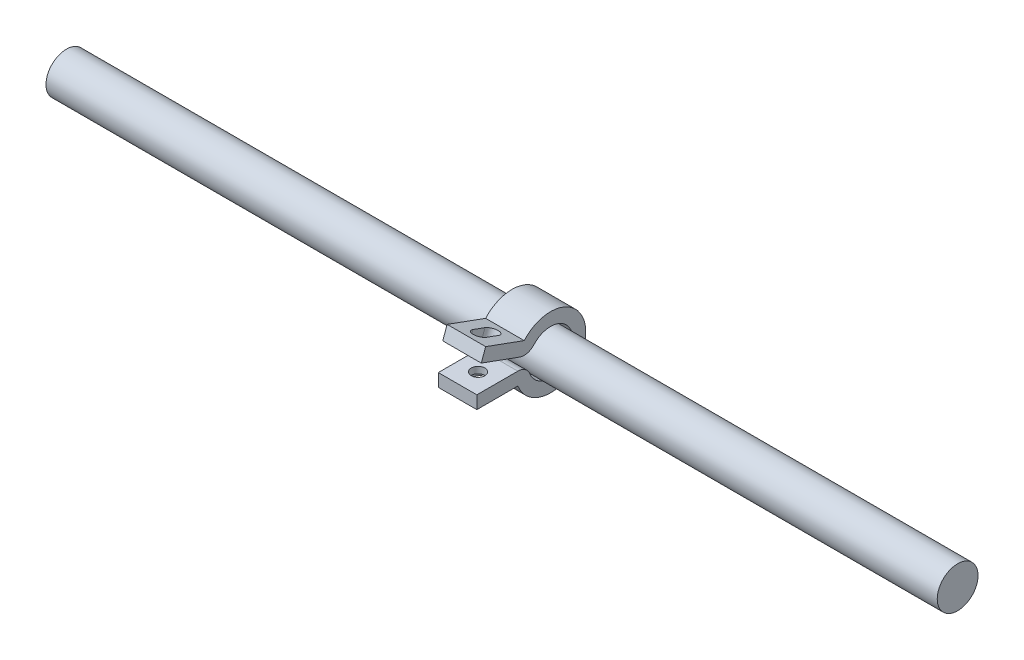
ISO-10303-21;
HEADER;
FILE_DESCRIPTION(('STEP AP214'),'2;1');
FILE_NAME('part.step','',(''),(''),'','','');
FILE_SCHEMA(('AUTOMOTIVE_DESIGN { 1 0 10303 214 1 1 1 1 }'));
ENDSEC;
DATA;
#1=APPLICATION_CONTEXT('core data for automotive mechanical design processes');
#2=APPLICATION_PROTOCOL_DEFINITION('international standard','automotive_design',2000,#1);
#3=PRODUCT_CONTEXT('',#1,'mechanical');
#4=PRODUCT('Part','Part','',(#3));
#5=PRODUCT_RELATED_PRODUCT_CATEGORY('part','',(#4));
#6=PRODUCT_DEFINITION_FORMATION('','',#4);
#7=PRODUCT_DEFINITION_CONTEXT('part definition',#1,'design');
#8=PRODUCT_DEFINITION('design','',#6,#7);
#9=PRODUCT_DEFINITION_SHAPE('','',#8);
#10=(LENGTH_UNIT() NAMED_UNIT(*) SI_UNIT(.MILLI.,.METRE.));
#11=(NAMED_UNIT(*) PLANE_ANGLE_UNIT() SI_UNIT($,.RADIAN.));
#12=(NAMED_UNIT(*) SI_UNIT($,.STERADIAN.) SOLID_ANGLE_UNIT());
#13=UNCERTAINTY_MEASURE_WITH_UNIT(LENGTH_MEASURE(1.E-05),#10,'distance_accuracy_value','');
#14=(GEOMETRIC_REPRESENTATION_CONTEXT(3) GLOBAL_UNCERTAINTY_ASSIGNED_CONTEXT((#13)) GLOBAL_UNIT_ASSIGNED_CONTEXT((#10,
#11,#12)) REPRESENTATION_CONTEXT('',''));
#15=CARTESIAN_POINT('',(0.,0.,0.));
#16=DIRECTION('',(0.,0.,1.));
#17=DIRECTION('',(1.,0.,0.));
#18=AXIS2_PLACEMENT_3D('',#15,#16,#17);
#19=CARTESIAN_POINT('',(6.,431.166,11.475));
#20=DIRECTION('',(0.,0.,-1.));
#21=DIRECTION('',(-1.,0.,0.));
#22=AXIS2_PLACEMENT_3D('',#19,#20,#21);
#23=PLANE('',#22);
#24=DIRECTION('',(0.,-1.,0.));
#25=VECTOR('',#24,1.);
#26=CARTESIAN_POINT('',(0.,431.166,11.475));
#27=LINE('',#26,#25);
#28=CARTESIAN_POINT('',(0.,431.166,11.475));
#29=VERTEX_POINT('',#28);
#30=CARTESIAN_POINT('',(0.,429.166,11.475));
#31=VERTEX_POINT('',#30);
#32=EDGE_CURVE('E265',#29,#31,#27,.T.);
#33=ORIENTED_EDGE('',*,*,#32,.T.);
#34=DIRECTION('',(-1.,0.,0.));
#35=VECTOR('',#34,1.);
#36=CARTESIAN_POINT('',(6.,429.166,11.475));
#37=LINE('',#36,#35);
#38=CARTESIAN_POINT('',(6.,429.166,11.475));
#39=VERTEX_POINT('',#38);
#40=EDGE_CURVE('E12',#39,#31,#37,.T.);
#41=ORIENTED_EDGE('',*,*,#40,.F.);
#42=DIRECTION('',(0.,-1.,0.));
#43=VECTOR('',#42,1.);
#44=CARTESIAN_POINT('',(6.,431.166,11.475));
#45=LINE('',#44,#43);
#46=CARTESIAN_POINT('',(6.,431.166,11.475));
#47=VERTEX_POINT('',#46);
#48=EDGE_CURVE('E271',#47,#39,#45,.T.);
#49=ORIENTED_EDGE('',*,*,#48,.F.);
#50=DIRECTION('',(-1.,0.,0.));
#51=VECTOR('',#50,1.);
#52=CARTESIAN_POINT('',(6.,431.166,11.475));
#53=LINE('',#52,#51);
#54=EDGE_CURVE('E293',#47,#29,#53,.T.);
#55=ORIENTED_EDGE('',*,*,#54,.T.);
#56=EDGE_LOOP('',(#33,#41,#49,#55));
#57=FACE_BOUND('',#56,.T.);
#58=ADVANCED_FACE('F47',(#57),#23,.F.);
#59=CARTESIAN_POINT('',(6.,429.166,11.475));
#60=DIRECTION('',(0.,1.,0.));
#61=DIRECTION('',(0.,0.,1.));
#62=AXIS2_PLACEMENT_3D('',#59,#60,#61);
#63=PLANE('',#62);
#64=DIRECTION('',(-1.,0.,0.));
#65=VECTOR('',#64,1.);
#66=CARTESIAN_POINT('',(4.15470053837925,429.166,10.285814393869));
#67=LINE('',#66,#65);
#68=CARTESIAN_POINT('',(4.15470053837925,429.166,10.285814393869));
#69=VERTEX_POINT('',#68);
#70=CARTESIAN_POINT('',(1.84529946162075,429.166,10.285814393869));
#71=VERTEX_POINT('',#70);
#72=EDGE_CURVE('E221',#69,#71,#67,.T.);
#73=ORIENTED_EDGE('',*,*,#72,.F.);
#74=DIRECTION('',(-0.500000000000001,0.,0.866025403784438));
#75=VECTOR('',#74,1.);
#76=CARTESIAN_POINT('',(5.3094010767585,429.166,8.28581439386901));
#77=LINE('',#76,#75);
#78=CARTESIAN_POINT('',(5.3094010767585,429.166,8.28581439386901));
#79=VERTEX_POINT('',#78);
#80=EDGE_CURVE('E61',#79,#69,#77,.T.);
#81=ORIENTED_EDGE('',*,*,#80,.F.);
#82=DIRECTION('',(0.499999999999999,0.,0.866025403784439));
#83=VECTOR('',#82,1.);
#84=CARTESIAN_POINT('',(4.15470053837925,429.166,6.28581439386901));
#85=LINE('',#84,#83);
#86=CARTESIAN_POINT('',(4.15470053837925,429.166,6.28581439386901));
#87=VERTEX_POINT('',#86);
#88=EDGE_CURVE('E204',#87,#79,#85,.T.);
#89=ORIENTED_EDGE('',*,*,#88,.F.);
#90=DIRECTION('',(1.,0.,0.));
#91=VECTOR('',#90,1.);
#92=CARTESIAN_POINT('',(1.84529946162075,429.166,6.28581439386901));
#93=LINE('',#92,#91);
#94=CARTESIAN_POINT('',(1.84529946162075,429.166,6.28581439386901));
#95=VERTEX_POINT('',#94);
#96=EDGE_CURVE('E207',#95,#87,#93,.T.);
#97=ORIENTED_EDGE('',*,*,#96,.F.);
#98=DIRECTION('',(0.5,0.,-0.866025403784439));
#99=VECTOR('',#98,1.);
#100=CARTESIAN_POINT('',(0.690598923241495,429.166,8.28581439386901));
#101=LINE('',#100,#99);
#102=CARTESIAN_POINT('',(0.690598923241495,429.166,8.28581439386901));
#103=VERTEX_POINT('',#102);
#104=EDGE_CURVE('E226',#103,#95,#101,.T.);
#105=ORIENTED_EDGE('',*,*,#104,.F.);
#106=DIRECTION('',(-0.5,0.,-0.866025403784439));
#107=VECTOR('',#106,1.);
#108=CARTESIAN_POINT('',(1.84529946162075,429.166,10.285814393869));
#109=LINE('',#108,#107);
#110=EDGE_CURVE('E223',#71,#103,#109,.T.);
#111=ORIENTED_EDGE('',*,*,#110,.F.);
#112=EDGE_LOOP('',(#73,#81,#89,#97,#105,#111));
#113=FACE_BOUND('',#112,.T.);
#114=DIRECTION('',(0.,0.,-1.));
#115=VECTOR('',#114,1.);
#116=CARTESIAN_POINT('',(0.,429.166,11.475));
#117=LINE('',#116,#115);
#118=CARTESIAN_POINT('',(0.,429.166,5.09662878773802));
#119=VERTEX_POINT('',#118);
#120=EDGE_CURVE('E296',#31,#119,#117,.T.);
#121=ORIENTED_EDGE('',*,*,#120,.T.);
#122=DIRECTION('',(-1.,0.,0.));
#123=VECTOR('',#122,1.);
#124=CARTESIAN_POINT('',(6.,429.166,5.09662878773802));
#125=LINE('',#124,#123);
#126=CARTESIAN_POINT('',(6.,429.166,5.09662878773802));
#127=VERTEX_POINT('',#126);
#128=EDGE_CURVE('E54',#127,#119,#125,.T.);
#129=ORIENTED_EDGE('',*,*,#128,.F.);
#130=DIRECTION('',(0.,0.,-1.));
#131=VECTOR('',#130,1.);
#132=CARTESIAN_POINT('',(6.,429.166,11.475));
#133=LINE('',#132,#131);
#134=EDGE_CURVE('E274',#39,#127,#133,.T.);
#135=ORIENTED_EDGE('',*,*,#134,.F.);
#136=ORIENTED_EDGE('',*,*,#40,.T.);
#137=EDGE_LOOP('',(#121,#129,#135,#136));
#138=FACE_BOUND('',#137,.T.);
#139=ADVANCED_FACE('F363',(#113,#138),#63,.F.);
#140=CARTESIAN_POINT('',(6.,431.166,0.));
#141=DIRECTION('',(-1.,0.,0.));
#142=DIRECTION('',(0.,0.,1.));
#143=AXIS2_PLACEMENT_3D('',#140,#141,#142);
#144=CYLINDRICAL_SURFACE('',#143,5.475);
#145=CARTESIAN_POINT('',(0.,431.166,0.));
#146=DIRECTION('',(1.,0.,0.));
#147=DIRECTION('',(0.,0.,-1.));
#148=AXIS2_PLACEMENT_3D('',#145,#146,#147);
#149=CIRCLE('',#148,5.475);
#150=CARTESIAN_POINT('',(0.,434.788534950032,4.10522417607114));
#151=VERTEX_POINT('',#150);
#152=EDGE_CURVE('E298',#119,#151,#149,.T.);
#153=ORIENTED_EDGE('',*,*,#152,.T.);
#154=DIRECTION('',(-1.,0.,0.));
#155=VECTOR('',#154,1.);
#156=CARTESIAN_POINT('',(6.,434.788534950032,4.10522417607114));
#157=LINE('',#156,#155);
#158=CARTESIAN_POINT('',(6.,434.788534950032,4.10522417607114));
#159=VERTEX_POINT('',#158);
#160=EDGE_CURVE('E333',#159,#151,#157,.T.);
#161=ORIENTED_EDGE('',*,*,#160,.F.);
#162=CARTESIAN_POINT('',(6.,431.166,0.));
#163=DIRECTION('',(1.,0.,0.));
#164=DIRECTION('',(0.,0.,-1.));
#165=AXIS2_PLACEMENT_3D('',#162,#163,#164);
#166=CIRCLE('',#165,5.475);
#167=EDGE_CURVE('E277',#127,#159,#166,.T.);
#168=ORIENTED_EDGE('',*,*,#167,.F.);
#169=ORIENTED_EDGE('',*,*,#128,.T.);
#170=EDGE_LOOP('',(#153,#161,#168,#169));
#171=FACE_BOUND('',#170,.T.);
#172=ADVANCED_FACE('F340',(#171),#144,.T.);
#173=CARTESIAN_POINT('',(6.,434.788534950032,4.10522417607114));
#174=DIRECTION('',(0.,-0.939692620785909,0.342020143325666));
#175=DIRECTION('',(0.,-0.342020143325666,-0.939692620785909));
#176=AXIS2_PLACEMENT_3D('',#173,#174,#175);
#177=PLANE('',#176);
#178=DIRECTION('',(0.,0.342020143325659,0.939692620785912));
#179=VECTOR('',#178,1.);
#180=CARTESIAN_POINT('',(1.94999999999999,435.537280524807,6.16238573568328));
#181=LINE('',#180,#179);
#182=CARTESIAN_POINT('',(1.94999999999999,435.537280524807,6.16238573568328));
#183=VERTEX_POINT('',#182);
#184=CARTESIAN_POINT('',(1.94999999999999,436.221320811459,8.04177097725509));
#185=VERTEX_POINT('',#184);
#186=EDGE_CURVE('E255',#183,#185,#181,.T.);
#187=ORIENTED_EDGE('',*,*,#186,.F.);
#188=CARTESIAN_POINT('',(2.99999999999999,435.537280524807,6.16238573568328));
#189=DIRECTION('',(0.,0.939692620785909,-0.342020143325667));
#190=DIRECTION('',(0.,0.342020143325667,0.939692620785909));
#191=AXIS2_PLACEMENT_3D('',#188,#189,#190);
#192=CIRCLE('',#191,1.05);
#193=CARTESIAN_POINT('',(4.04999999999999,435.537280524807,6.16238573568328));
#194=VERTEX_POINT('',#193);
#195=EDGE_CURVE('E69',#194,#183,#192,.T.);
#196=ORIENTED_EDGE('',*,*,#195,.F.);
#197=DIRECTION('',(0.,-0.342020143325659,-0.939692620785912));
#198=VECTOR('',#197,1.);
#199=CARTESIAN_POINT('',(4.04999999999999,435.537280524807,6.16238573568328));
#200=LINE('',#199,#198);
#201=CARTESIAN_POINT('',(4.04999999999999,436.221320811459,8.04177097725509));
#202=VERTEX_POINT('',#201);
#203=EDGE_CURVE('E244',#202,#194,#200,.T.);
#204=ORIENTED_EDGE('',*,*,#203,.F.);
#205=CARTESIAN_POINT('',(2.99999999999999,436.221320811459,8.04177097725509));
#206=DIRECTION('',(0.,0.939692620785909,-0.342020143325667));
#207=DIRECTION('',(0.,0.342020143325667,0.939692620785909));
#208=AXIS2_PLACEMENT_3D('',#205,#206,#207);
#209=CIRCLE('',#208,1.05);
#210=EDGE_CURVE('E258',#185,#202,#209,.T.);
#211=ORIENTED_EDGE('',*,*,#210,.F.);
#212=EDGE_LOOP('',(#187,#196,#204,#211));
#213=FACE_BOUND('',#212,.T.);
#214=DIRECTION('',(0.,0.342020143325666,0.939692620785909));
#215=VECTOR('',#214,1.);
#216=CARTESIAN_POINT('',(0.,434.788534950032,4.10522417607114));
#217=LINE('',#216,#215);
#218=CARTESIAN_POINT('',(0.,436.970066386234,10.098932536867));
#219=VERTEX_POINT('',#218);
#220=EDGE_CURVE('E300',#151,#219,#217,.T.);
#221=ORIENTED_EDGE('',*,*,#220,.T.);
#222=DIRECTION('',(-1.,0.,0.));
#223=VECTOR('',#222,1.);
#224=CARTESIAN_POINT('',(6.,436.970066386234,10.098932536867));
#225=LINE('',#224,#223);
#226=CARTESIAN_POINT('',(6.,436.970066386234,10.098932536867));
#227=VERTEX_POINT('',#226);
#228=EDGE_CURVE('E330',#227,#219,#225,.T.);
#229=ORIENTED_EDGE('',*,*,#228,.F.);
#230=DIRECTION('',(0.,0.342020143325666,0.939692620785909));
#231=VECTOR('',#230,1.);
#232=CARTESIAN_POINT('',(6.,434.788534950032,4.10522417607114));
#233=LINE('',#232,#231);
#234=EDGE_CURVE('E279',#159,#227,#233,.T.);
#235=ORIENTED_EDGE('',*,*,#234,.F.);
#236=ORIENTED_EDGE('',*,*,#160,.T.);
#237=EDGE_LOOP('',(#221,#229,#235,#236));
#238=FACE_BOUND('',#237,.T.);
#239=ADVANCED_FACE('F351',(#213,#238),#177,.F.);
#240=CARTESIAN_POINT('',(6.,435.090681144662,10.7829728235183));
#241=DIRECTION('',(0.,-0.342020143325661,-0.939692620785911));
#242=DIRECTION('',(0.,0.939692620785911,-0.342020143325661));
#243=AXIS2_PLACEMENT_3D('',#240,#241,#242);
#244=PLANE('',#243);
#245=DIRECTION('',(0.,-0.939692620785911,0.342020143325661));
#246=VECTOR('',#245,1.);
#247=CARTESIAN_POINT('',(0.,435.090681144662,10.7829728235183));
#248=LINE('',#247,#246);
#249=CARTESIAN_POINT('',(0.,435.090681144662,10.7829728235183));
#250=VERTEX_POINT('',#249);
#251=EDGE_CURVE('E302',#219,#250,#248,.T.);
#252=ORIENTED_EDGE('',*,*,#251,.T.);
#253=DIRECTION('',(-1.,0.,0.));
#254=VECTOR('',#253,1.);
#255=CARTESIAN_POINT('',(6.,435.090681144662,10.7829728235183));
#256=LINE('',#255,#254);
#257=CARTESIAN_POINT('',(6.,435.090681144662,10.7829728235183));
#258=VERTEX_POINT('',#257);
#259=EDGE_CURVE('E327',#258,#250,#256,.T.);
#260=ORIENTED_EDGE('',*,*,#259,.F.);
#261=DIRECTION('',(0.,-0.939692620785911,0.342020143325661));
#262=VECTOR('',#261,1.);
#263=CARTESIAN_POINT('',(6.,435.090681144662,10.7829728235183));
#264=LINE('',#263,#262);
#265=EDGE_CURVE('E281',#227,#258,#264,.T.);
#266=ORIENTED_EDGE('',*,*,#265,.F.);
#267=ORIENTED_EDGE('',*,*,#228,.T.);
#268=EDGE_LOOP('',(#252,#260,#266,#267));
#269=FACE_BOUND('',#268,.T.);
#270=ADVANCED_FACE('F355',(#269),#244,.F.);
#271=CARTESIAN_POINT('',(6.,432.90914970846,4.78926446272246));
#272=DIRECTION('',(0.,0.939692620785909,-0.342020143325667));
#273=DIRECTION('',(0.,0.342020143325667,0.939692620785909));
#274=AXIS2_PLACEMENT_3D('',#271,#272,#273);
#275=PLANE('',#274);
#276=DIRECTION('',(0.,-0.342020143325659,-0.939692620785912));
#277=VECTOR('',#276,1.);
#278=CARTESIAN_POINT('',(4.04999999999999,433.657895283236,6.84642602233462));
#279=LINE('',#278,#277);
#280=CARTESIAN_POINT('',(4.04999999999999,434.341935569887,8.72581126390642));
#281=VERTEX_POINT('',#280);
#282=CARTESIAN_POINT('',(4.04999999999999,433.657895283236,6.84642602233462));
#283=VERTEX_POINT('',#282);
#284=EDGE_CURVE('E250',#281,#283,#279,.T.);
#285=ORIENTED_EDGE('',*,*,#284,.T.);
#286=CARTESIAN_POINT('',(2.99999999999999,433.657895283236,6.84642602233462));
#287=DIRECTION('',(0.,0.939692620785909,-0.342020143325667));
#288=DIRECTION('',(0.,0.342020143325667,0.939692620785909));
#289=AXIS2_PLACEMENT_3D('',#286,#287,#288);
#290=CIRCLE('',#289,1.05);
#291=CARTESIAN_POINT('',(1.94999999999999,433.657895283236,6.84642602233462));
#292=VERTEX_POINT('',#291);
#293=EDGE_CURVE('E240',#283,#292,#290,.T.);
#294=ORIENTED_EDGE('',*,*,#293,.T.);
#295=DIRECTION('',(0.,0.342020143325659,0.939692620785912));
#296=VECTOR('',#295,1.);
#297=CARTESIAN_POINT('',(1.94999999999999,433.657895283236,6.84642602233462));
#298=LINE('',#297,#296);
#299=CARTESIAN_POINT('',(1.94999999999999,434.341935569887,8.72581126390642));
#300=VERTEX_POINT('',#299);
#301=EDGE_CURVE('E243',#292,#300,#298,.T.);
#302=ORIENTED_EDGE('',*,*,#301,.T.);
#303=CARTESIAN_POINT('',(2.99999999999999,434.341935569887,8.72581126390642));
#304=DIRECTION('',(0.,0.939692620785909,-0.342020143325667));
#305=DIRECTION('',(0.,0.342020143325667,0.939692620785909));
#306=AXIS2_PLACEMENT_3D('',#303,#304,#305);
#307=CIRCLE('',#306,1.05);
#308=EDGE_CURVE('E247',#300,#281,#307,.T.);
#309=ORIENTED_EDGE('',*,*,#308,.T.);
#310=EDGE_LOOP('',(#285,#294,#302,#309));
#311=FACE_BOUND('',#310,.T.);
#312=DIRECTION('',(0.,-0.342020143325667,-0.939692620785909));
#313=VECTOR('',#312,1.);
#314=CARTESIAN_POINT('',(0.,432.90914970846,4.78926446272246));
#315=LINE('',#314,#313);
#316=CARTESIAN_POINT('',(0.,432.90914970846,4.78926446272246));
#317=VERTEX_POINT('',#316);
#318=EDGE_CURVE('E304',#250,#317,#315,.T.);
#319=ORIENTED_EDGE('',*,*,#318,.T.);
#320=DIRECTION('',(-1.,0.,0.));
#321=VECTOR('',#320,1.);
#322=CARTESIAN_POINT('',(6.,432.90914970846,4.78926446272246));
#323=LINE('',#322,#321);
#324=CARTESIAN_POINT('',(6.,432.90914970846,4.78926446272246));
#325=VERTEX_POINT('',#324);
#326=EDGE_CURVE('E324',#325,#317,#323,.T.);
#327=ORIENTED_EDGE('',*,*,#326,.F.);
#328=DIRECTION('',(0.,-0.342020143325667,-0.939692620785909));
#329=VECTOR('',#328,1.);
#330=CARTESIAN_POINT('',(6.,432.90914970846,4.78926446272246));
#331=LINE('',#330,#329);
#332=EDGE_CURVE('E283',#258,#325,#331,.T.);
#333=ORIENTED_EDGE('',*,*,#332,.F.);
#334=ORIENTED_EDGE('',*,*,#259,.T.);
#335=EDGE_LOOP('',(#319,#327,#333,#334));
#336=FACE_BOUND('',#335,.T.);
#337=ADVANCED_FACE('F386',(#311,#336),#275,.F.);
#338=CARTESIAN_POINT('',(6.,434.788534950032,4.10522417607112));
#339=DIRECTION('',(-1.,0.,0.));
#340=DIRECTION('',(0.,0.,1.));
#341=AXIS2_PLACEMENT_3D('',#338,#339,#340);
#342=CYLINDRICAL_SURFACE('',#341,2.00000000000001);
#343=CARTESIAN_POINT('',(0.,434.788534950032,4.10522417607112));
#344=DIRECTION('',(1.,0.,0.));
#345=DIRECTION('',(0.,0.,1.));
#346=AXIS2_PLACEMENT_3D('',#343,#344,#345);
#347=CIRCLE('',#346,2.00000000000001);
#348=CARTESIAN_POINT('',(0.,433.465234511664,2.60559890627344));
#349=VERTEX_POINT('',#348);
#350=EDGE_CURVE('E306',#317,#349,#347,.T.);
#351=ORIENTED_EDGE('',*,*,#350,.T.);
#352=DIRECTION('',(-1.,0.,0.));
#353=VECTOR('',#352,1.);
#354=CARTESIAN_POINT('',(6.,433.465234511664,2.60559890627344));
#355=LINE('',#354,#353);
#356=CARTESIAN_POINT('',(6.,433.465234511664,2.60559890627344));
#357=VERTEX_POINT('',#356);
#358=EDGE_CURVE('E321',#357,#349,#355,.T.);
#359=ORIENTED_EDGE('',*,*,#358,.F.);
#360=CARTESIAN_POINT('',(6.,434.788534950032,4.10522417607112));
#361=DIRECTION('',(1.,0.,0.));
#362=DIRECTION('',(0.,0.,1.));
#363=AXIS2_PLACEMENT_3D('',#360,#361,#362);
#364=CIRCLE('',#363,2.00000000000001);
#365=EDGE_CURVE('E285',#325,#357,#364,.T.);
#366=ORIENTED_EDGE('',*,*,#365,.F.);
#367=ORIENTED_EDGE('',*,*,#326,.T.);
#368=EDGE_LOOP('',(#351,#359,#366,#367));
#369=FACE_BOUND('',#368,.T.);
#370=ADVANCED_FACE('F383',(#369),#342,.T.);
#371=CARTESIAN_POINT('',(6.,431.166,0.));
#372=DIRECTION('',(-1.,0.,0.));
#373=DIRECTION('',(0.,0.,1.));
#374=AXIS2_PLACEMENT_3D('',#371,#372,#373);
#375=CYLINDRICAL_SURFACE('',#374,3.475);
#376=CARTESIAN_POINT('',(0.,431.166,0.));
#377=DIRECTION('',(-1.,0.,0.));
#378=DIRECTION('',(0.,0.,-1.));
#379=AXIS2_PLACEMENT_3D('',#376,#377,#378);
#380=CIRCLE('',#379,3.475);
#381=CARTESIAN_POINT('',(0.,429.896593607306,3.23484658217162));
#382=VERTEX_POINT('',#381);
#383=EDGE_CURVE('E308',#349,#382,#380,.T.);
#384=ORIENTED_EDGE('',*,*,#383,.T.);
#385=DIRECTION('',(-1.,0.,0.));
#386=VECTOR('',#385,1.);
#387=CARTESIAN_POINT('',(6.,429.896593607306,3.23484658217162));
#388=LINE('',#387,#386);
#389=CARTESIAN_POINT('',(6.,429.896593607306,3.23484658217162));
#390=VERTEX_POINT('',#389);
#391=EDGE_CURVE('E318',#390,#382,#388,.T.);
#392=ORIENTED_EDGE('',*,*,#391,.F.);
#393=CARTESIAN_POINT('',(6.,431.166,0.));
#394=DIRECTION('',(-1.,0.,0.));
#395=DIRECTION('',(0.,0.,-1.));
#396=AXIS2_PLACEMENT_3D('',#393,#394,#395);
#397=CIRCLE('',#396,3.475);
#398=EDGE_CURVE('E287',#357,#390,#397,.T.);
#399=ORIENTED_EDGE('',*,*,#398,.F.);
#400=ORIENTED_EDGE('',*,*,#358,.T.);
#401=EDGE_LOOP('',(#384,#392,#399,#400));
#402=FACE_BOUND('',#401,.T.);
#403=ADVANCED_FACE('F379',(#402),#375,.F.);
#404=CARTESIAN_POINT('',(6.,429.166,5.09662878773803));
#405=DIRECTION('',(-1.,0.,0.));
#406=DIRECTION('',(0.,0.,1.));
#407=AXIS2_PLACEMENT_3D('',#404,#405,#406);
#408=CYLINDRICAL_SURFACE('',#407,2.);
#409=CARTESIAN_POINT('',(0.,429.166,5.09662878773803));
#410=DIRECTION('',(1.,0.,0.));
#411=DIRECTION('',(0.,0.,1.));
#412=AXIS2_PLACEMENT_3D('',#409,#410,#411);
#413=CIRCLE('',#412,2.);
#414=CARTESIAN_POINT('',(0.,431.166,5.09662878773803));
#415=VERTEX_POINT('',#414);
#416=EDGE_CURVE('E310',#382,#415,#413,.T.);
#417=ORIENTED_EDGE('',*,*,#416,.T.);
#418=DIRECTION('',(-1.,0.,0.));
#419=VECTOR('',#418,1.);
#420=CARTESIAN_POINT('',(6.,431.166,5.09662878773803));
#421=LINE('',#420,#419);
#422=CARTESIAN_POINT('',(6.,431.166,5.09662878773803));
#423=VERTEX_POINT('',#422);
#424=EDGE_CURVE('E315',#423,#415,#421,.T.);
#425=ORIENTED_EDGE('',*,*,#424,.F.);
#426=CARTESIAN_POINT('',(6.,429.166,5.09662878773803));
#427=DIRECTION('',(1.,0.,0.));
#428=DIRECTION('',(0.,0.,1.));
#429=AXIS2_PLACEMENT_3D('',#426,#427,#428);
#430=CIRCLE('',#429,2.);
#431=EDGE_CURVE('E289',#390,#423,#430,.T.);
#432=ORIENTED_EDGE('',*,*,#431,.F.);
#433=ORIENTED_EDGE('',*,*,#391,.T.);
#434=EDGE_LOOP('',(#417,#425,#432,#433));
#435=FACE_BOUND('',#434,.T.);
#436=ADVANCED_FACE('F375',(#435),#408,.T.);
#437=CARTESIAN_POINT('',(6.,431.166,11.475));
#438=DIRECTION('',(0.,-1.,0.));
#439=DIRECTION('',(0.,0.,-1.));
#440=AXIS2_PLACEMENT_3D('',#437,#438,#439);
#441=PLANE('',#440);
#442=CARTESIAN_POINT('',(3.,431.166,8.28581439386901));
#443=DIRECTION('',(0.,-1.,0.));
#444=DIRECTION('',(0.,0.,-1.));
#445=AXIS2_PLACEMENT_3D('',#442,#443,#444);
#446=CIRCLE('',#445,1.05);
#447=CARTESIAN_POINT('',(3.,431.166,7.23581439386901));
#448=VERTEX_POINT('',#447);
#449=EDGE_CURVE('E659',#448,#448,#446,.T.);
#450=ORIENTED_EDGE('',*,*,#449,.T.);
#451=EDGE_LOOP('',(#450));
#452=FACE_BOUND('',#451,.T.);
#453=DIRECTION('',(0.,0.,1.));
#454=VECTOR('',#453,1.);
#455=CARTESIAN_POINT('',(0.,431.166,11.475));
#456=LINE('',#455,#454);
#457=EDGE_CURVE('E275',#415,#29,#456,.T.);
#458=ORIENTED_EDGE('',*,*,#457,.T.);
#459=ORIENTED_EDGE('',*,*,#54,.F.);
#460=DIRECTION('',(0.,0.,1.));
#461=VECTOR('',#460,1.);
#462=CARTESIAN_POINT('',(6.,431.166,11.475));
#463=LINE('',#462,#461);
#464=EDGE_CURVE('E291',#423,#47,#463,.T.);
#465=ORIENTED_EDGE('',*,*,#464,.F.);
#466=ORIENTED_EDGE('',*,*,#424,.T.);
#467=EDGE_LOOP('',(#458,#459,#465,#466));
#468=FACE_BOUND('',#467,.T.);
#469=ADVANCED_FACE('F370',(#452,#468),#441,.F.);
#470=CARTESIAN_POINT('',(6.,431.166,0.));
#471=DIRECTION('',(1.,0.,0.));
#472=DIRECTION('',(0.,0.,-1.));
#473=AXIS2_PLACEMENT_3D('',#470,#471,#472);
#474=PLANE('',#473);
#475=ORIENTED_EDGE('',*,*,#48,.T.);
#476=ORIENTED_EDGE('',*,*,#134,.T.);
#477=ORIENTED_EDGE('',*,*,#167,.T.);
#478=ORIENTED_EDGE('',*,*,#234,.T.);
#479=ORIENTED_EDGE('',*,*,#265,.T.);
#480=ORIENTED_EDGE('',*,*,#332,.T.);
#481=ORIENTED_EDGE('',*,*,#365,.T.);
#482=ORIENTED_EDGE('',*,*,#398,.T.);
#483=ORIENTED_EDGE('',*,*,#431,.T.);
#484=ORIENTED_EDGE('',*,*,#464,.T.);
#485=EDGE_LOOP('',(#475,#476,#477,#478,#479,#480,#481,#482,#483,#484));
#486=FACE_BOUND('',#485,.T.);
#487=ADVANCED_FACE('F359',(#486),#474,.T.);
#488=CARTESIAN_POINT('',(0.,431.166,0.));
#489=DIRECTION('',(1.,0.,0.));
#490=DIRECTION('',(0.,0.,-1.));
#491=AXIS2_PLACEMENT_3D('',#488,#489,#490);
#492=PLANE('',#491);
#493=ORIENTED_EDGE('',*,*,#32,.F.);
#494=ORIENTED_EDGE('',*,*,#457,.F.);
#495=ORIENTED_EDGE('',*,*,#416,.F.);
#496=ORIENTED_EDGE('',*,*,#383,.F.);
#497=ORIENTED_EDGE('',*,*,#350,.F.);
#498=ORIENTED_EDGE('',*,*,#318,.F.);
#499=ORIENTED_EDGE('',*,*,#251,.F.);
#500=ORIENTED_EDGE('',*,*,#220,.F.);
#501=ORIENTED_EDGE('',*,*,#152,.F.);
#502=ORIENTED_EDGE('',*,*,#120,.F.);
#503=EDGE_LOOP('',(#493,#494,#495,#496,#497,#498,#499,#500,#501,#502));
#504=FACE_BOUND('',#503,.T.);
#505=ADVANCED_FACE('F346',(#504),#492,.F.);
#506=CARTESIAN_POINT('',(2.99999999999999,433.657895283236,6.84642602233462));
#507=DIRECTION('',(0.,0.939692620785909,-0.342020143325667));
#508=DIRECTION('',(0.,0.342020143325667,0.939692620785909));
#509=AXIS2_PLACEMENT_3D('',#506,#507,#508);
#510=CYLINDRICAL_SURFACE('',#509,1.05);
#511=ORIENTED_EDGE('',*,*,#195,.T.);
#512=DIRECTION('',(0.,0.939692620785909,-0.342020143325667));
#513=VECTOR('',#512,1.);
#514=CARTESIAN_POINT('',(1.94999999999999,433.657895283236,6.84642602233462));
#515=LINE('',#514,#513);
#516=EDGE_CURVE('E253',#292,#183,#515,.T.);
#517=ORIENTED_EDGE('',*,*,#516,.F.);
#518=ORIENTED_EDGE('',*,*,#293,.F.);
#519=DIRECTION('',(0.,0.939692620785909,-0.342020143325667));
#520=VECTOR('',#519,1.);
#521=CARTESIAN_POINT('',(4.04999999999999,433.657895283236,6.84642602233462));
#522=LINE('',#521,#520);
#523=EDGE_CURVE('E263',#283,#194,#522,.T.);
#524=ORIENTED_EDGE('',*,*,#523,.T.);
#525=EDGE_LOOP('',(#511,#517,#518,#524));
#526=FACE_BOUND('',#525,.T.);
#527=ADVANCED_FACE('F418',(#526),#510,.F.);
#528=CARTESIAN_POINT('',(4.04999999999999,433.657895283236,6.84642602233462));
#529=DIRECTION('',(1.,0.,0.));
#530=DIRECTION('',(0.,0.,-1.));
#531=AXIS2_PLACEMENT_3D('',#528,#529,#530);
#532=PLANE('',#531);
#533=ORIENTED_EDGE('',*,*,#203,.T.);
#534=ORIENTED_EDGE('',*,*,#523,.F.);
#535=ORIENTED_EDGE('',*,*,#284,.F.);
#536=DIRECTION('',(0.,0.939692620785909,-0.342020143325667));
#537=VECTOR('',#536,1.);
#538=CARTESIAN_POINT('',(4.04999999999999,434.341935569887,8.72581126390642));
#539=LINE('',#538,#537);
#540=EDGE_CURVE('E266',#281,#202,#539,.T.);
#541=ORIENTED_EDGE('',*,*,#540,.T.);
#542=EDGE_LOOP('',(#533,#534,#535,#541));
#543=FACE_BOUND('',#542,.T.);
#544=ADVANCED_FACE('F421',(#543),#532,.F.);
#545=CARTESIAN_POINT('',(2.99999999999999,434.341935569887,8.72581126390642));
#546=DIRECTION('',(0.,0.939692620785909,-0.342020143325667));
#547=DIRECTION('',(0.,0.342020143325667,0.939692620785909));
#548=AXIS2_PLACEMENT_3D('',#545,#546,#547);
#549=CYLINDRICAL_SURFACE('',#548,1.05);
#550=ORIENTED_EDGE('',*,*,#210,.T.);
#551=ORIENTED_EDGE('',*,*,#540,.F.);
#552=ORIENTED_EDGE('',*,*,#308,.F.);
#553=DIRECTION('',(0.,0.939692620785909,-0.342020143325667));
#554=VECTOR('',#553,1.);
#555=CARTESIAN_POINT('',(1.94999999999999,434.341935569887,8.72581126390642));
#556=LINE('',#555,#554);
#557=EDGE_CURVE('E268',#300,#185,#556,.T.);
#558=ORIENTED_EDGE('',*,*,#557,.T.);
#559=EDGE_LOOP('',(#550,#551,#552,#558));
#560=FACE_BOUND('',#559,.T.);
#561=ADVANCED_FACE('F423',(#560),#549,.F.);
#562=CARTESIAN_POINT('',(1.94999999999999,433.657895283236,6.84642602233462));
#563=DIRECTION('',(-1.,0.,0.));
#564=DIRECTION('',(0.,0.,1.));
#565=AXIS2_PLACEMENT_3D('',#562,#563,#564);
#566=PLANE('',#565);
#567=ORIENTED_EDGE('',*,*,#186,.T.);
#568=ORIENTED_EDGE('',*,*,#557,.F.);
#569=ORIENTED_EDGE('',*,*,#301,.F.);
#570=ORIENTED_EDGE('',*,*,#516,.T.);
#571=EDGE_LOOP('',(#567,#568,#569,#570));
#572=FACE_BOUND('',#571,.T.);
#573=ADVANCED_FACE('F415',(#572),#566,.F.);
#574=CARTESIAN_POINT('',(5.3094010767585,430.166,8.28581439386901));
#575=DIRECTION('',(0.866025403784438,0.,0.500000000000001));
#576=DIRECTION('',(0.500000000000001,0.,-0.866025403784438));
#577=AXIS2_PLACEMENT_3D('',#574,#575,#576);
#578=PLANE('',#577);
#579=ORIENTED_EDGE('',*,*,#80,.T.);
#580=DIRECTION('',(0.,-1.,0.));
#581=VECTOR('',#580,1.);
#582=CARTESIAN_POINT('',(4.15470053837925,430.166,10.285814393869));
#583=LINE('',#582,#581);
#584=CARTESIAN_POINT('',(4.15470053837925,430.166,10.285814393869));
#585=VERTEX_POINT('',#584);
#586=EDGE_CURVE('E181',#585,#69,#583,.T.);
#587=ORIENTED_EDGE('',*,*,#586,.F.);
#588=DIRECTION('',(-0.500000000000001,0.,0.866025403784438));
#589=VECTOR('',#588,1.);
#590=CARTESIAN_POINT('',(5.3094010767585,430.166,8.28581439386901));
#591=LINE('',#590,#589);
#592=CARTESIAN_POINT('',(5.3094010767585,430.166,8.28581439386901));
#593=VERTEX_POINT('',#592);
#594=EDGE_CURVE('E185',#593,#585,#591,.T.);
#595=ORIENTED_EDGE('',*,*,#594,.F.);
#596=DIRECTION('',(0.,-1.,0.));
#597=VECTOR('',#596,1.);
#598=CARTESIAN_POINT('',(5.3094010767585,430.166,8.28581439386901));
#599=LINE('',#598,#597);
#600=EDGE_CURVE('E231',#593,#79,#599,.T.);
#601=ORIENTED_EDGE('',*,*,#600,.T.);
#602=EDGE_LOOP('',(#579,#587,#595,#601));
#603=FACE_BOUND('',#602,.T.);
#604=ADVANCED_FACE('F183',(#603),#578,.F.);
#605=CARTESIAN_POINT('',(4.15470053837925,430.166,6.28581439386901));
#606=DIRECTION('',(0.866025403784439,0.,-0.499999999999999));
#607=DIRECTION('',(-0.5,0.,-0.866025403784439));
#608=AXIS2_PLACEMENT_3D('',#605,#606,#607);
#609=PLANE('',#608);
#610=ORIENTED_EDGE('',*,*,#88,.T.);
#611=ORIENTED_EDGE('',*,*,#600,.F.);
#612=DIRECTION('',(0.499999999999999,0.,0.866025403784439));
#613=VECTOR('',#612,1.);
#614=CARTESIAN_POINT('',(4.15470053837925,430.166,6.28581439386901));
#615=LINE('',#614,#613);
#616=CARTESIAN_POINT('',(4.15470053837925,430.166,6.28581439386901));
#617=VERTEX_POINT('',#616);
#618=EDGE_CURVE('E191',#617,#593,#615,.T.);
#619=ORIENTED_EDGE('',*,*,#618,.F.);
#620=DIRECTION('',(0.,-1.,0.));
#621=VECTOR('',#620,1.);
#622=CARTESIAN_POINT('',(4.15470053837925,430.166,6.28581439386901));
#623=LINE('',#622,#621);
#624=EDGE_CURVE('E233',#617,#87,#623,.T.);
#625=ORIENTED_EDGE('',*,*,#624,.T.);
#626=EDGE_LOOP('',(#610,#611,#619,#625));
#627=FACE_BOUND('',#626,.T.);
#628=ADVANCED_FACE('F505',(#627),#609,.F.);
#629=CARTESIAN_POINT('',(1.84529946162075,430.166,6.28581439386901));
#630=DIRECTION('',(0.,0.,-1.));
#631=DIRECTION('',(-1.,0.,0.));
#632=AXIS2_PLACEMENT_3D('',#629,#630,#631);
#633=PLANE('',#632);
#634=ORIENTED_EDGE('',*,*,#96,.T.);
#635=ORIENTED_EDGE('',*,*,#624,.F.);
#636=DIRECTION('',(1.,0.,0.));
#637=VECTOR('',#636,1.);
#638=CARTESIAN_POINT('',(1.84529946162075,430.166,6.28581439386901));
#639=LINE('',#638,#637);
#640=CARTESIAN_POINT('',(1.84529946162075,430.166,6.28581439386901));
#641=VERTEX_POINT('',#640);
#642=EDGE_CURVE('E217',#641,#617,#639,.T.);
#643=ORIENTED_EDGE('',*,*,#642,.F.);
#644=DIRECTION('',(0.,-1.,0.));
#645=VECTOR('',#644,1.);
#646=CARTESIAN_POINT('',(1.84529946162075,430.166,6.28581439386901));
#647=LINE('',#646,#645);
#648=EDGE_CURVE('E235',#641,#95,#647,.T.);
#649=ORIENTED_EDGE('',*,*,#648,.T.);
#650=EDGE_LOOP('',(#634,#635,#643,#649));
#651=FACE_BOUND('',#650,.T.);
#652=ADVANCED_FACE('F514',(#651),#633,.F.);
#653=CARTESIAN_POINT('',(0.690598923241495,430.166,8.28581439386901));
#654=DIRECTION('',(-0.866025403784439,0.,-0.5));
#655=DIRECTION('',(-0.5,0.,0.866025403784439));
#656=AXIS2_PLACEMENT_3D('',#653,#654,#655);
#657=PLANE('',#656);
#658=ORIENTED_EDGE('',*,*,#104,.T.);
#659=ORIENTED_EDGE('',*,*,#648,.F.);
#660=DIRECTION('',(0.5,0.,-0.866025403784439));
#661=VECTOR('',#660,1.);
#662=CARTESIAN_POINT('',(0.690598923241495,430.166,8.28581439386901));
#663=LINE('',#662,#661);
#664=CARTESIAN_POINT('',(0.690598923241495,430.166,8.28581439386901));
#665=VERTEX_POINT('',#664);
#666=EDGE_CURVE('E214',#665,#641,#663,.T.);
#667=ORIENTED_EDGE('',*,*,#666,.F.);
#668=DIRECTION('',(0.,-1.,0.));
#669=VECTOR('',#668,1.);
#670=CARTESIAN_POINT('',(0.690598923241495,430.166,8.28581439386901));
#671=LINE('',#670,#669);
#672=EDGE_CURVE('E237',#665,#103,#671,.T.);
#673=ORIENTED_EDGE('',*,*,#672,.T.);
#674=EDGE_LOOP('',(#658,#659,#667,#673));
#675=FACE_BOUND('',#674,.T.);
#676=ADVANCED_FACE('F525',(#675),#657,.F.);
#677=CARTESIAN_POINT('',(1.84529946162075,430.166,10.285814393869));
#678=DIRECTION('',(-0.866025403784439,0.,0.5));
#679=DIRECTION('',(0.5,0.,0.866025403784439));
#680=AXIS2_PLACEMENT_3D('',#677,#678,#679);
#681=PLANE('',#680);
#682=ORIENTED_EDGE('',*,*,#110,.T.);
#683=ORIENTED_EDGE('',*,*,#672,.F.);
#684=DIRECTION('',(-0.5,0.,-0.866025403784439));
#685=VECTOR('',#684,1.);
#686=CARTESIAN_POINT('',(1.84529946162075,430.166,10.285814393869));
#687=LINE('',#686,#685);
#688=CARTESIAN_POINT('',(1.84529946162075,430.166,10.285814393869));
#689=VERTEX_POINT('',#688);
#690=EDGE_CURVE('E199',#689,#665,#687,.T.);
#691=ORIENTED_EDGE('',*,*,#690,.F.);
#692=DIRECTION('',(0.,-1.,0.));
#693=VECTOR('',#692,1.);
#694=CARTESIAN_POINT('',(1.84529946162075,430.166,10.285814393869));
#695=LINE('',#694,#693);
#696=EDGE_CURVE('E190',#689,#71,#695,.T.);
#697=ORIENTED_EDGE('',*,*,#696,.T.);
#698=EDGE_LOOP('',(#682,#683,#691,#697));
#699=FACE_BOUND('',#698,.T.);
#700=ADVANCED_FACE('F536',(#699),#681,.F.);
#701=CARTESIAN_POINT('',(4.15470053837925,430.166,10.285814393869));
#702=DIRECTION('',(0.,0.,1.));
#703=DIRECTION('',(1.,0.,0.));
#704=AXIS2_PLACEMENT_3D('',#701,#702,#703);
#705=PLANE('',#704);
#706=ORIENTED_EDGE('',*,*,#72,.T.);
#707=ORIENTED_EDGE('',*,*,#696,.F.);
#708=DIRECTION('',(-1.,0.,0.));
#709=VECTOR('',#708,1.);
#710=CARTESIAN_POINT('',(4.15470053837925,430.166,10.285814393869));
#711=LINE('',#710,#709);
#712=EDGE_CURVE('E194',#585,#689,#711,.T.);
#713=ORIENTED_EDGE('',*,*,#712,.F.);
#714=ORIENTED_EDGE('',*,*,#586,.T.);
#715=EDGE_LOOP('',(#706,#707,#713,#714));
#716=FACE_BOUND('',#715,.T.);
#717=ADVANCED_FACE('F195',(#716),#705,.F.);
#718=CARTESIAN_POINT('',(0.,430.166,0.));
#719=DIRECTION('',(0.,-1.,0.));
#720=DIRECTION('',(0.,0.,-1.));
#721=AXIS2_PLACEMENT_3D('',#718,#719,#720);
#722=PLANE('',#721);
#723=CARTESIAN_POINT('',(3.,430.166,8.28581439386901));
#724=DIRECTION('',(0.,-1.,0.));
#725=DIRECTION('',(0.,0.,-1.));
#726=AXIS2_PLACEMENT_3D('',#723,#724,#725);
#727=CIRCLE('',#726,1.05);
#728=CARTESIAN_POINT('',(3.,430.166,7.23581439386901));
#729=VERTEX_POINT('',#728);
#730=EDGE_CURVE('E210',#729,#729,#727,.T.);
#731=ORIENTED_EDGE('',*,*,#730,.F.);
#732=EDGE_LOOP('',(#731));
#733=FACE_BOUND('',#732,.T.);
#734=ORIENTED_EDGE('',*,*,#594,.T.);
#735=ORIENTED_EDGE('',*,*,#712,.T.);
#736=ORIENTED_EDGE('',*,*,#690,.T.);
#737=ORIENTED_EDGE('',*,*,#666,.T.);
#738=ORIENTED_EDGE('',*,*,#642,.T.);
#739=ORIENTED_EDGE('',*,*,#618,.T.);
#740=EDGE_LOOP('',(#734,#735,#736,#737,#738,#739));
#741=FACE_BOUND('',#740,.T.);
#742=ADVANCED_FACE('F201',(#733,#741),#722,.T.);
#743=CARTESIAN_POINT('',(3.,431.166,8.28581439386901));
#744=DIRECTION('',(0.,-1.,0.));
#745=DIRECTION('',(0.,0.,-1.));
#746=AXIS2_PLACEMENT_3D('',#743,#744,#745);
#747=CYLINDRICAL_SURFACE('',#746,1.05);
#748=ORIENTED_EDGE('',*,*,#730,.T.);
#749=EDGE_LOOP('',(#748));
#750=FACE_BOUND('',#749,.T.);
#751=ORIENTED_EDGE('',*,*,#449,.F.);
#752=EDGE_LOOP('',(#751));
#753=FACE_BOUND('',#752,.T.);
#754=ADVANCED_FACE('F564',(#750,#753),#747,.F.);
#755=CLOSED_SHELL('',(#58,#139,#172,#239,#270,#337,#370,#403,#436,#469,#487,#505,#527,#544,#561,
#573,#604,#628,#652,#676,#700,#717,#742,#754));
#756=MANIFOLD_SOLID_BREP('B2',#755);
#757=CARTESIAN_POINT('',(-69.3420000000001,431.166,0.));
#758=DIRECTION('',(1.,0.,0.));
#759=DIRECTION('',(0.,0.,-1.));
#760=AXIS2_PLACEMENT_3D('',#757,#758,#759);
#761=CYLINDRICAL_SURFACE('',#760,3.175);
#762=CARTESIAN_POINT('',(-69.3420000000001,431.166,0.));
#763=DIRECTION('',(-1.,0.,0.));
#764=DIRECTION('',(0.,0.,1.));
#765=AXIS2_PLACEMENT_3D('',#762,#763,#764);
#766=CIRCLE('',#765,3.175);
#767=CARTESIAN_POINT('',(-69.3420000000001,431.166,3.175));
#768=VERTEX_POINT('',#767);
#769=EDGE_CURVE('E46',#768,#768,#766,.T.);
#770=ORIENTED_EDGE('',*,*,#769,.F.);
#771=EDGE_LOOP('',(#770));
#772=FACE_BOUND('',#771,.T.);
#773=CARTESIAN_POINT('',(69.342,431.166,0.));
#774=DIRECTION('',(-1.,0.,0.));
#775=DIRECTION('',(0.,0.,1.));
#776=AXIS2_PLACEMENT_3D('',#773,#774,#775);
#777=CIRCLE('',#776,3.175);
#778=CARTESIAN_POINT('',(69.342,431.166,3.175));
#779=VERTEX_POINT('',#778);
#780=EDGE_CURVE('E671',#779,#779,#777,.T.);
#781=ORIENTED_EDGE('',*,*,#780,.T.);
#782=EDGE_LOOP('',(#781));
#783=FACE_BOUND('',#782,.T.);
#784=ADVANCED_FACE('F668',(#772,#783),#761,.T.);
#785=CARTESIAN_POINT('',(-69.3420000000001,431.166,0.));
#786=DIRECTION('',(-1.,0.,0.));
#787=DIRECTION('',(0.,0.,1.));
#788=AXIS2_PLACEMENT_3D('',#785,#786,#787);
#789=PLANE('',#788);
#790=ORIENTED_EDGE('',*,*,#769,.T.);
#791=EDGE_LOOP('',(#790));
#792=FACE_BOUND('',#791,.T.);
#793=ADVANCED_FACE('F683',(#792),#789,.T.);
#794=CARTESIAN_POINT('',(69.342,431.166,0.));
#795=DIRECTION('',(-1.,0.,0.));
#796=DIRECTION('',(0.,0.,1.));
#797=AXIS2_PLACEMENT_3D('',#794,#795,#796);
#798=PLANE('',#797);
#799=ORIENTED_EDGE('',*,*,#780,.F.);
#800=EDGE_LOOP('',(#799));
#801=FACE_BOUND('',#800,.T.);
#802=ADVANCED_FACE('F681',(#801),#798,.F.);
#803=CLOSED_SHELL('',(#784,#793,#802));
#804=MANIFOLD_SOLID_BREP('B6_NOT_SHOWN',#803);
#805=ADVANCED_BREP_SHAPE_REPRESENTATION('',(#18,#756,#804),#14);
#806=SHAPE_DEFINITION_REPRESENTATION(#9,#805);
ENDSEC;
END-ISO-10303-21;
